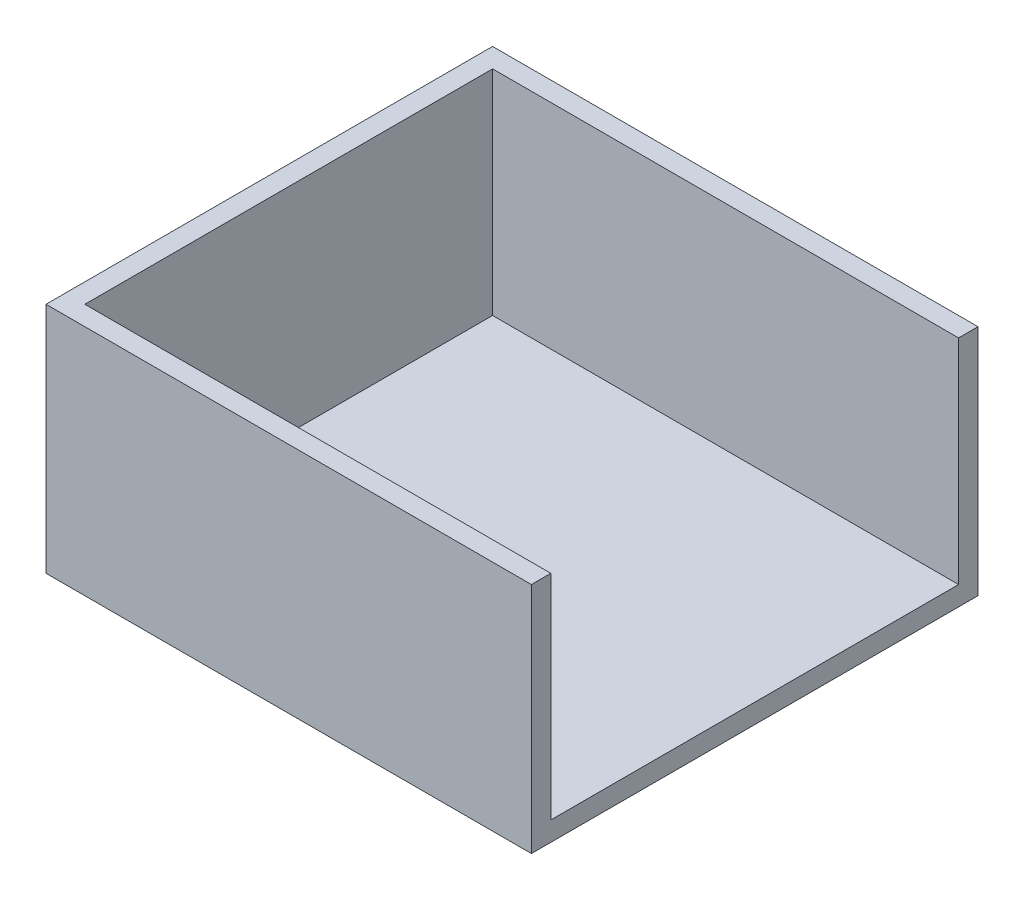
ISO-10303-21;
HEADER;
FILE_DESCRIPTION(('STEP AP214'),'2;1');
FILE_NAME('part.step','',(''),(''),'','','');
FILE_SCHEMA(('AUTOMOTIVE_DESIGN { 1 0 10303 214 1 1 1 1 }'));
ENDSEC;
DATA;
#1=APPLICATION_CONTEXT('core data for automotive mechanical design processes');
#2=APPLICATION_PROTOCOL_DEFINITION('international standard','automotive_design',2000,#1);
#3=PRODUCT_CONTEXT('',#1,'mechanical');
#4=PRODUCT('Part','Part','',(#3));
#5=PRODUCT_RELATED_PRODUCT_CATEGORY('part','',(#4));
#6=PRODUCT_DEFINITION_FORMATION('','',#4);
#7=PRODUCT_DEFINITION_CONTEXT('part definition',#1,'design');
#8=PRODUCT_DEFINITION('design','',#6,#7);
#9=PRODUCT_DEFINITION_SHAPE('','',#8);
#10=(LENGTH_UNIT() NAMED_UNIT(*) SI_UNIT(.MILLI.,.METRE.));
#11=(NAMED_UNIT(*) PLANE_ANGLE_UNIT() SI_UNIT($,.RADIAN.));
#12=(NAMED_UNIT(*) SI_UNIT($,.STERADIAN.) SOLID_ANGLE_UNIT());
#13=UNCERTAINTY_MEASURE_WITH_UNIT(LENGTH_MEASURE(1.E-05),#10,'distance_accuracy_value','');
#14=(GEOMETRIC_REPRESENTATION_CONTEXT(3) GLOBAL_UNCERTAINTY_ASSIGNED_CONTEXT((#13)) GLOBAL_UNIT_ASSIGNED_CONTEXT((#10,
#11,#12)) REPRESENTATION_CONTEXT('',''));
#15=CARTESIAN_POINT('',(0.,0.,0.));
#16=DIRECTION('',(0.,0.,1.));
#17=DIRECTION('',(1.,0.,0.));
#18=AXIS2_PLACEMENT_3D('',#15,#16,#17);
#19=CARTESIAN_POINT('',(12.5,12.,11.5));
#20=DIRECTION('',(-1.,0.,0.));
#21=DIRECTION('',(0.,0.,1.));
#22=AXIS2_PLACEMENT_3D('',#19,#20,#21);
#23=PLANE('',#22);
#24=DIRECTION('',(0.,-1.,0.));
#25=VECTOR('',#24,1.);
#26=CARTESIAN_POINT('',(12.5,12.,10.5));
#27=LINE('',#26,#25);
#28=CARTESIAN_POINT('',(12.5,12.,10.5));
#29=VERTEX_POINT('',#28);
#30=CARTESIAN_POINT('',(12.5,1.,10.5));
#31=VERTEX_POINT('',#30);
#32=EDGE_CURVE('E139',#29,#31,#27,.T.);
#33=ORIENTED_EDGE('',*,*,#32,.F.);
#34=DIRECTION('',(0.,0.,-1.));
#35=VECTOR('',#34,1.);
#36=CARTESIAN_POINT('',(12.5,12.,11.5));
#37=LINE('',#36,#35);
#38=CARTESIAN_POINT('',(12.5,12.,11.5));
#39=VERTEX_POINT('',#38);
#40=EDGE_CURVE('E130',#39,#29,#37,.T.);
#41=ORIENTED_EDGE('',*,*,#40,.F.);
#42=DIRECTION('',(0.,-1.,0.));
#43=VECTOR('',#42,1.);
#44=CARTESIAN_POINT('',(12.5,12.,11.5));
#45=LINE('',#44,#43);
#46=CARTESIAN_POINT('',(12.5,0.,11.5));
#47=VERTEX_POINT('',#46);
#48=EDGE_CURVE('E159',#39,#47,#45,.T.);
#49=ORIENTED_EDGE('',*,*,#48,.T.);
#50=DIRECTION('',(0.,0.,-1.));
#51=VECTOR('',#50,1.);
#52=CARTESIAN_POINT('',(12.5,0.,11.5));
#53=LINE('',#52,#51);
#54=CARTESIAN_POINT('',(12.5,0.,-11.5));
#55=VERTEX_POINT('',#54);
#56=EDGE_CURVE('E153',#47,#55,#53,.T.);
#57=ORIENTED_EDGE('',*,*,#56,.T.);
#58=DIRECTION('',(0.,-1.,0.));
#59=VECTOR('',#58,1.);
#60=CARTESIAN_POINT('',(12.5,12.,-11.5));
#61=LINE('',#60,#59);
#62=CARTESIAN_POINT('',(12.5,12.,-11.5));
#63=VERTEX_POINT('',#62);
#64=EDGE_CURVE('E157',#63,#55,#61,.T.);
#65=ORIENTED_EDGE('',*,*,#64,.F.);
#66=CARTESIAN_POINT('',(12.5,12.,-10.5));
#67=VERTEX_POINT('',#66);
#68=EDGE_CURVE('E145',#67,#63,#37,.T.);
#69=ORIENTED_EDGE('',*,*,#68,.F.);
#70=DIRECTION('',(0.,1.,0.));
#71=VECTOR('',#70,1.);
#72=CARTESIAN_POINT('',(12.5,12.,-10.5));
#73=LINE('',#72,#71);
#74=CARTESIAN_POINT('',(12.5,1.,-10.5));
#75=VERTEX_POINT('',#74);
#76=EDGE_CURVE('E48',#75,#67,#73,.T.);
#77=ORIENTED_EDGE('',*,*,#76,.F.);
#78=DIRECTION('',(0.,0.,-1.));
#79=VECTOR('',#78,1.);
#80=CARTESIAN_POINT('',(12.5,1.,11.5));
#81=LINE('',#80,#79);
#82=EDGE_CURVE('E11',#31,#75,#81,.T.);
#83=ORIENTED_EDGE('',*,*,#82,.F.);
#84=EDGE_LOOP('',(#33,#41,#49,#57,#65,#69,#77,#83));
#85=FACE_BOUND('',#84,.T.);
#86=ADVANCED_FACE('F33',(#85),#23,.F.);
#87=CARTESIAN_POINT('',(0.,12.,0.));
#88=DIRECTION('',(0.,1.,0.));
#89=DIRECTION('',(0.,0.,1.));
#90=AXIS2_PLACEMENT_3D('',#87,#88,#89);
#91=PLANE('',#90);
#92=ORIENTED_EDGE('',*,*,#40,.T.);
#93=DIRECTION('',(1.,0.,0.));
#94=VECTOR('',#93,1.);
#95=CARTESIAN_POINT('',(-11.5,12.,10.5));
#96=LINE('',#95,#94);
#97=CARTESIAN_POINT('',(-11.5,12.,10.5));
#98=VERTEX_POINT('',#97);
#99=EDGE_CURVE('E118',#98,#29,#96,.T.);
#100=ORIENTED_EDGE('',*,*,#99,.F.);
#101=DIRECTION('',(0.,0.,1.));
#102=VECTOR('',#101,1.);
#103=CARTESIAN_POINT('',(-11.5,12.,-10.5));
#104=LINE('',#103,#102);
#105=CARTESIAN_POINT('',(-11.5,12.,-10.5));
#106=VERTEX_POINT('',#105);
#107=EDGE_CURVE('E109',#106,#98,#104,.T.);
#108=ORIENTED_EDGE('',*,*,#107,.F.);
#109=DIRECTION('',(1.,0.,0.));
#110=VECTOR('',#109,1.);
#111=CARTESIAN_POINT('',(0.,12.,-10.5));
#112=LINE('',#111,#110);
#113=EDGE_CURVE('E41',#106,#67,#112,.T.);
#114=ORIENTED_EDGE('',*,*,#113,.T.);
#115=ORIENTED_EDGE('',*,*,#68,.T.);
#116=DIRECTION('',(-1.,0.,0.));
#117=VECTOR('',#116,1.);
#118=CARTESIAN_POINT('',(12.5,12.,-11.5));
#119=LINE('',#118,#117);
#120=CARTESIAN_POINT('',(-12.5,12.,-11.5));
#121=VERTEX_POINT('',#120);
#122=EDGE_CURVE('E57',#63,#121,#119,.T.);
#123=ORIENTED_EDGE('',*,*,#122,.T.);
#124=DIRECTION('',(0.,0.,1.));
#125=VECTOR('',#124,1.);
#126=CARTESIAN_POINT('',(-12.5,12.,11.5));
#127=LINE('',#126,#125);
#128=CARTESIAN_POINT('',(-12.5,12.,11.5));
#129=VERTEX_POINT('',#128);
#130=EDGE_CURVE('E142',#121,#129,#127,.T.);
#131=ORIENTED_EDGE('',*,*,#130,.T.);
#132=DIRECTION('',(1.,0.,0.));
#133=VECTOR('',#132,1.);
#134=CARTESIAN_POINT('',(12.5,12.,11.5));
#135=LINE('',#134,#133);
#136=EDGE_CURVE('E86',#129,#39,#135,.T.);
#137=ORIENTED_EDGE('',*,*,#136,.T.);
#138=EDGE_LOOP('',(#92,#100,#108,#114,#115,#123,#131,#137));
#139=FACE_BOUND('',#138,.T.);
#140=ADVANCED_FACE('F128',(#139),#91,.T.);
#141=CARTESIAN_POINT('',(-12.5,12.,11.5));
#142=DIRECTION('',(1.,0.,0.));
#143=DIRECTION('',(0.,0.,-1.));
#144=AXIS2_PLACEMENT_3D('',#141,#142,#143);
#145=PLANE('',#144);
#146=DIRECTION('',(0.,0.,1.));
#147=VECTOR('',#146,1.);
#148=CARTESIAN_POINT('',(-12.5,0.,11.5));
#149=LINE('',#148,#147);
#150=CARTESIAN_POINT('',(-12.5,0.,-11.5));
#151=VERTEX_POINT('',#150);
#152=CARTESIAN_POINT('',(-12.5,0.,11.5));
#153=VERTEX_POINT('',#152);
#154=EDGE_CURVE('E141',#151,#153,#149,.T.);
#155=ORIENTED_EDGE('',*,*,#154,.T.);
#156=DIRECTION('',(0.,-1.,0.));
#157=VECTOR('',#156,1.);
#158=CARTESIAN_POINT('',(-12.5,12.,11.5));
#159=LINE('',#158,#157);
#160=EDGE_CURVE('E162',#129,#153,#159,.T.);
#161=ORIENTED_EDGE('',*,*,#160,.F.);
#162=ORIENTED_EDGE('',*,*,#130,.F.);
#163=DIRECTION('',(0.,-1.,0.));
#164=VECTOR('',#163,1.);
#165=CARTESIAN_POINT('',(-12.5,12.,-11.5));
#166=LINE('',#165,#164);
#167=EDGE_CURVE('E148',#121,#151,#166,.T.);
#168=ORIENTED_EDGE('',*,*,#167,.T.);
#169=EDGE_LOOP('',(#155,#161,#162,#168));
#170=FACE_BOUND('',#169,.T.);
#171=ADVANCED_FACE('F35',(#170),#145,.F.);
#172=CARTESIAN_POINT('',(12.5,12.,11.5));
#173=DIRECTION('',(0.,0.,-1.));
#174=DIRECTION('',(-1.,0.,0.));
#175=AXIS2_PLACEMENT_3D('',#172,#173,#174);
#176=PLANE('',#175);
#177=DIRECTION('',(1.,0.,0.));
#178=VECTOR('',#177,1.);
#179=CARTESIAN_POINT('',(12.5,0.,11.5));
#180=LINE('',#179,#178);
#181=EDGE_CURVE('E151',#153,#47,#180,.T.);
#182=ORIENTED_EDGE('',*,*,#181,.T.);
#183=ORIENTED_EDGE('',*,*,#48,.F.);
#184=ORIENTED_EDGE('',*,*,#136,.F.);
#185=ORIENTED_EDGE('',*,*,#160,.T.);
#186=EDGE_LOOP('',(#182,#183,#184,#185));
#187=FACE_BOUND('',#186,.T.);
#188=ADVANCED_FACE('F173',(#187),#176,.F.);
#189=CARTESIAN_POINT('',(12.5,12.,-11.5));
#190=DIRECTION('',(0.,0.,1.));
#191=DIRECTION('',(1.,0.,0.));
#192=AXIS2_PLACEMENT_3D('',#189,#190,#191);
#193=PLANE('',#192);
#194=DIRECTION('',(-1.,0.,0.));
#195=VECTOR('',#194,1.);
#196=CARTESIAN_POINT('',(12.5,0.,-11.5));
#197=LINE('',#196,#195);
#198=EDGE_CURVE('E78',#55,#151,#197,.T.);
#199=ORIENTED_EDGE('',*,*,#198,.T.);
#200=ORIENTED_EDGE('',*,*,#167,.F.);
#201=ORIENTED_EDGE('',*,*,#122,.F.);
#202=ORIENTED_EDGE('',*,*,#64,.T.);
#203=EDGE_LOOP('',(#199,#200,#201,#202));
#204=FACE_BOUND('',#203,.T.);
#205=ADVANCED_FACE('F168',(#204),#193,.F.);
#206=CARTESIAN_POINT('',(0.,0.,0.));
#207=DIRECTION('',(0.,1.,0.));
#208=DIRECTION('',(0.,0.,1.));
#209=AXIS2_PLACEMENT_3D('',#206,#207,#208);
#210=PLANE('',#209);
#211=ORIENTED_EDGE('',*,*,#154,.F.);
#212=ORIENTED_EDGE('',*,*,#198,.F.);
#213=ORIENTED_EDGE('',*,*,#56,.F.);
#214=ORIENTED_EDGE('',*,*,#181,.F.);
#215=EDGE_LOOP('',(#211,#212,#213,#214));
#216=FACE_BOUND('',#215,.T.);
#217=ADVANCED_FACE('F199',(#216),#210,.F.);
#218=CARTESIAN_POINT('',(0.,1.,0.));
#219=DIRECTION('',(0.,1.,0.));
#220=DIRECTION('',(0.,0.,1.));
#221=AXIS2_PLACEMENT_3D('',#218,#219,#220);
#222=PLANE('',#221);
#223=ORIENTED_EDGE('',*,*,#82,.T.);
#224=DIRECTION('',(-1.,0.,0.));
#225=VECTOR('',#224,1.);
#226=CARTESIAN_POINT('',(-11.5,1.,-10.5));
#227=LINE('',#226,#225);
#228=CARTESIAN_POINT('',(-11.5,1.,-10.5));
#229=VERTEX_POINT('',#228);
#230=EDGE_CURVE('E119',#75,#229,#227,.T.);
#231=ORIENTED_EDGE('',*,*,#230,.T.);
#232=DIRECTION('',(0.,0.,1.));
#233=VECTOR('',#232,1.);
#234=CARTESIAN_POINT('',(-11.5,1.,-10.5));
#235=LINE('',#234,#233);
#236=CARTESIAN_POINT('',(-11.5,1.,10.5));
#237=VERTEX_POINT('',#236);
#238=EDGE_CURVE('E134',#229,#237,#235,.T.);
#239=ORIENTED_EDGE('',*,*,#238,.T.);
#240=DIRECTION('',(1.,0.,0.));
#241=VECTOR('',#240,1.);
#242=CARTESIAN_POINT('',(-11.5,1.,10.5));
#243=LINE('',#242,#241);
#244=EDGE_CURVE('E125',#237,#31,#243,.T.);
#245=ORIENTED_EDGE('',*,*,#244,.T.);
#246=EDGE_LOOP('',(#223,#231,#239,#245));
#247=FACE_BOUND('',#246,.T.);
#248=ADVANCED_FACE('F175',(#247),#222,.T.);
#249=CARTESIAN_POINT('',(-11.5,12.,10.5));
#250=DIRECTION('',(0.,0.,-1.));
#251=DIRECTION('',(-1.,0.,0.));
#252=AXIS2_PLACEMENT_3D('',#249,#250,#251);
#253=PLANE('',#252);
#254=ORIENTED_EDGE('',*,*,#32,.T.);
#255=ORIENTED_EDGE('',*,*,#244,.F.);
#256=DIRECTION('',(0.,-1.,0.));
#257=VECTOR('',#256,1.);
#258=CARTESIAN_POINT('',(-11.5,12.,10.5));
#259=LINE('',#258,#257);
#260=EDGE_CURVE('E113',#98,#237,#259,.T.);
#261=ORIENTED_EDGE('',*,*,#260,.F.);
#262=ORIENTED_EDGE('',*,*,#99,.T.);
#263=EDGE_LOOP('',(#254,#255,#261,#262));
#264=FACE_BOUND('',#263,.T.);
#265=ADVANCED_FACE('F122',(#264),#253,.T.);
#266=CARTESIAN_POINT('',(-11.5,12.,-10.5));
#267=DIRECTION('',(0.,0.,1.));
#268=DIRECTION('',(1.,0.,0.));
#269=AXIS2_PLACEMENT_3D('',#266,#267,#268);
#270=PLANE('',#269);
#271=ORIENTED_EDGE('',*,*,#76,.T.);
#272=ORIENTED_EDGE('',*,*,#113,.F.);
#273=DIRECTION('',(0.,-1.,0.));
#274=VECTOR('',#273,1.);
#275=CARTESIAN_POINT('',(-11.5,12.,-10.5));
#276=LINE('',#275,#274);
#277=EDGE_CURVE('E116',#106,#229,#276,.T.);
#278=ORIENTED_EDGE('',*,*,#277,.T.);
#279=ORIENTED_EDGE('',*,*,#230,.F.);
#280=EDGE_LOOP('',(#271,#272,#278,#279));
#281=FACE_BOUND('',#280,.T.);
#282=ADVANCED_FACE('F176',(#281),#270,.T.);
#283=CARTESIAN_POINT('',(-11.5,12.,-10.5));
#284=DIRECTION('',(1.,0.,0.));
#285=DIRECTION('',(0.,0.,-1.));
#286=AXIS2_PLACEMENT_3D('',#283,#284,#285);
#287=PLANE('',#286);
#288=ORIENTED_EDGE('',*,*,#238,.F.);
#289=ORIENTED_EDGE('',*,*,#277,.F.);
#290=ORIENTED_EDGE('',*,*,#107,.T.);
#291=ORIENTED_EDGE('',*,*,#260,.T.);
#292=EDGE_LOOP('',(#288,#289,#290,#291));
#293=FACE_BOUND('',#292,.T.);
#294=ADVANCED_FACE('F112',(#293),#287,.T.);
#295=CLOSED_SHELL('',(#86,#140,#171,#188,#205,#217,#248,#265,#282,#294));
#296=MANIFOLD_SOLID_BREP('B2',#295);
#297=ADVANCED_BREP_SHAPE_REPRESENTATION('',(#18,#296),#14);
#298=SHAPE_DEFINITION_REPRESENTATION(#9,#297);
ENDSEC;
END-ISO-10303-21;
